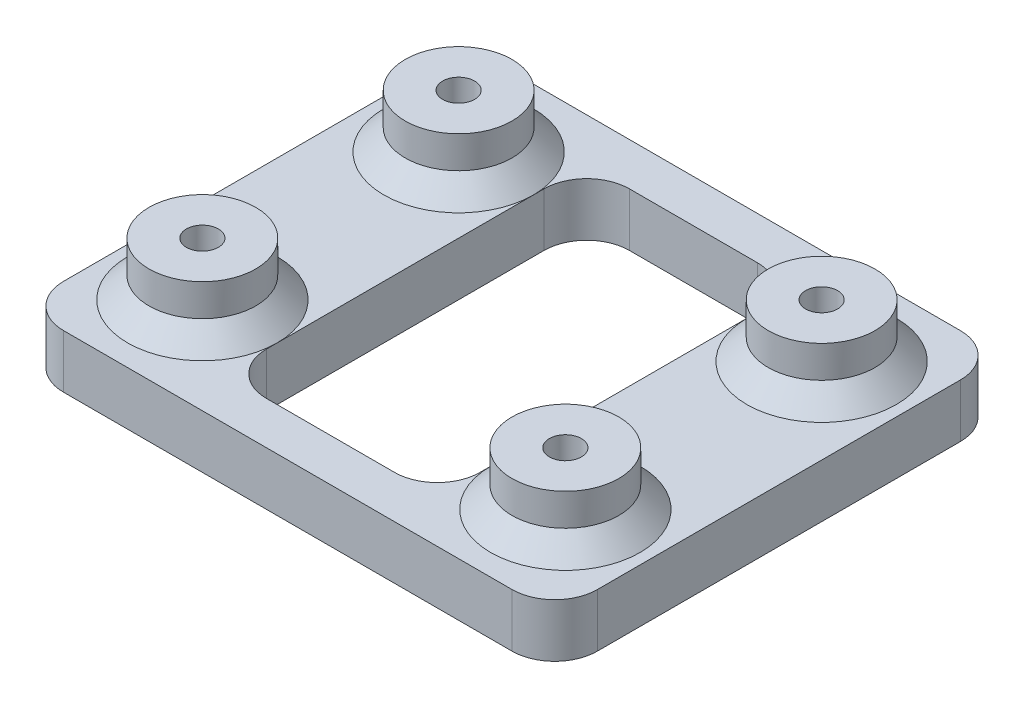
ISO-10303-21;
HEADER;
FILE_DESCRIPTION(('STEP AP214'),'2;1');
FILE_NAME('part.step','',(''),(''),'','','');
FILE_SCHEMA(('AUTOMOTIVE_DESIGN { 1 0 10303 214 1 1 1 1 }'));
ENDSEC;
DATA;
#1=APPLICATION_CONTEXT('core data for automotive mechanical design processes');
#2=APPLICATION_PROTOCOL_DEFINITION('international standard','automotive_design',2000,#1);
#3=PRODUCT_CONTEXT('',#1,'mechanical');
#4=PRODUCT('Part','Part','',(#3));
#5=PRODUCT_RELATED_PRODUCT_CATEGORY('part','',(#4));
#6=PRODUCT_DEFINITION_FORMATION('','',#4);
#7=PRODUCT_DEFINITION_CONTEXT('part definition',#1,'design');
#8=PRODUCT_DEFINITION('design','',#6,#7);
#9=PRODUCT_DEFINITION_SHAPE('','',#8);
#10=(LENGTH_UNIT() NAMED_UNIT(*) SI_UNIT(.MILLI.,.METRE.));
#11=(NAMED_UNIT(*) PLANE_ANGLE_UNIT() SI_UNIT($,.RADIAN.));
#12=(NAMED_UNIT(*) SI_UNIT($,.STERADIAN.) SOLID_ANGLE_UNIT());
#13=UNCERTAINTY_MEASURE_WITH_UNIT(LENGTH_MEASURE(1.E-05),#10,'distance_accuracy_value','');
#14=(GEOMETRIC_REPRESENTATION_CONTEXT(3) GLOBAL_UNCERTAINTY_ASSIGNED_CONTEXT((#13)) GLOBAL_UNIT_ASSIGNED_CONTEXT((#10,
#11,#12)) REPRESENTATION_CONTEXT('',''));
#15=CARTESIAN_POINT('',(0.,0.,0.));
#16=DIRECTION('',(0.,0.,1.));
#17=DIRECTION('',(1.,0.,0.));
#18=AXIS2_PLACEMENT_3D('',#15,#16,#17);
#19=CARTESIAN_POINT('',(0.,3.175,0.));
#20=DIRECTION('',(0.,-1.,0.));
#21=DIRECTION('',(0.,0.,-1.));
#22=AXIS2_PLACEMENT_3D('',#19,#20,#21);
#23=PLANE('',#22);
#24=DIRECTION('',(0.,0.,1.));
#25=VECTOR('',#24,1.);
#26=CARTESIAN_POINT('',(-6.35,3.175,10.795));
#27=LINE('',#26,#25);
#28=CARTESIAN_POINT('',(-6.35,3.175,-7.62));
#29=VERTEX_POINT('',#28);
#30=CARTESIAN_POINT('',(-6.35,3.175,7.62));
#31=VERTEX_POINT('',#30);
#32=EDGE_CURVE('E584',#29,#31,#27,.T.);
#33=ORIENTED_EDGE('',*,*,#32,.F.);
#34=CARTESIAN_POINT('',(-10.795,3.175,-7.62));
#35=DIRECTION('',(0.,-1.,0.));
#36=DIRECTION('',(0.,0.,-1.));
#37=AXIS2_PLACEMENT_3D('',#34,#35,#36);
#38=CIRCLE('',#37,4.44499999999999);
#39=EDGE_CURVE('E58',#29,#29,#38,.T.);
#40=ORIENTED_EDGE('',*,*,#39,.T.);
#41=CARTESIAN_POINT('',(-6.35,3.175,-8.255));
#42=VERTEX_POINT('',#41);
#43=EDGE_CURVE('E576',#42,#29,#27,.T.);
#44=ORIENTED_EDGE('',*,*,#43,.F.);
#45=CARTESIAN_POINT('',(-3.81,3.175,-8.255));
#46=DIRECTION('',(0.,-1.,0.));
#47=DIRECTION('',(0.,0.,-1.));
#48=AXIS2_PLACEMENT_3D('',#45,#46,#47);
#49=CIRCLE('',#48,2.54);
#50=CARTESIAN_POINT('',(-3.81,3.175,-10.795));
#51=VERTEX_POINT('',#50);
#52=EDGE_CURVE('E297',#42,#51,#49,.T.);
#53=ORIENTED_EDGE('',*,*,#52,.T.);
#54=DIRECTION('',(-1.,0.,0.));
#55=VECTOR('',#54,1.);
#56=CARTESIAN_POINT('',(-6.35,3.175,-10.795));
#57=LINE('',#56,#55);
#58=CARTESIAN_POINT('',(3.81,3.175,-10.795));
#59=VERTEX_POINT('',#58);
#60=EDGE_CURVE('E604',#59,#51,#57,.T.);
#61=ORIENTED_EDGE('',*,*,#60,.F.);
#62=CARTESIAN_POINT('',(3.81,3.175,-8.255));
#63=DIRECTION('',(0.,-1.,0.));
#64=DIRECTION('',(0.,0.,-1.));
#65=AXIS2_PLACEMENT_3D('',#62,#63,#64);
#66=CIRCLE('',#65,2.54);
#67=CARTESIAN_POINT('',(6.35,3.175,-8.255));
#68=VERTEX_POINT('',#67);
#69=EDGE_CURVE('E290',#59,#68,#66,.T.);
#70=ORIENTED_EDGE('',*,*,#69,.T.);
#71=DIRECTION('',(0.,0.,-1.));
#72=VECTOR('',#71,1.);
#73=CARTESIAN_POINT('',(6.35,3.175,10.795));
#74=LINE('',#73,#72);
#75=CARTESIAN_POINT('',(6.35,3.175,-7.62));
#76=VERTEX_POINT('',#75);
#77=EDGE_CURVE('E606',#76,#68,#74,.T.);
#78=ORIENTED_EDGE('',*,*,#77,.F.);
#79=CARTESIAN_POINT('',(10.795,3.175,-7.62));
#80=DIRECTION('',(0.,-1.,0.));
#81=DIRECTION('',(0.,0.,-1.));
#82=AXIS2_PLACEMENT_3D('',#79,#80,#81);
#83=CIRCLE('',#82,4.44499999999999);
#84=EDGE_CURVE('E313',#76,#76,#83,.T.);
#85=ORIENTED_EDGE('',*,*,#84,.T.);
#86=CARTESIAN_POINT('',(6.35,3.175,7.62));
#87=VERTEX_POINT('',#86);
#88=EDGE_CURVE('E605',#87,#76,#74,.T.);
#89=ORIENTED_EDGE('',*,*,#88,.F.);
#90=CARTESIAN_POINT('',(10.795,3.175,7.62));
#91=DIRECTION('',(0.,-1.,0.));
#92=DIRECTION('',(0.,0.,-1.));
#93=AXIS2_PLACEMENT_3D('',#90,#91,#92);
#94=CIRCLE('',#93,4.44499999999999);
#95=EDGE_CURVE('E309',#87,#87,#94,.T.);
#96=ORIENTED_EDGE('',*,*,#95,.T.);
#97=CARTESIAN_POINT('',(6.35,3.175,8.255));
#98=VERTEX_POINT('',#97);
#99=EDGE_CURVE('E601',#98,#87,#74,.T.);
#100=ORIENTED_EDGE('',*,*,#99,.F.);
#101=CARTESIAN_POINT('',(3.81,3.175,8.255));
#102=DIRECTION('',(0.,-1.,0.));
#103=DIRECTION('',(0.,0.,-1.));
#104=AXIS2_PLACEMENT_3D('',#101,#102,#103);
#105=CIRCLE('',#104,2.54);
#106=CARTESIAN_POINT('',(3.81,3.175,10.795));
#107=VERTEX_POINT('',#106);
#108=EDGE_CURVE('E284',#98,#107,#105,.T.);
#109=ORIENTED_EDGE('',*,*,#108,.T.);
#110=DIRECTION('',(1.,0.,0.));
#111=VECTOR('',#110,1.);
#112=CARTESIAN_POINT('',(-6.35,3.175,10.795));
#113=LINE('',#112,#111);
#114=CARTESIAN_POINT('',(-3.81,3.175,10.795));
#115=VERTEX_POINT('',#114);
#116=EDGE_CURVE('E572',#115,#107,#113,.T.);
#117=ORIENTED_EDGE('',*,*,#116,.F.);
#118=CARTESIAN_POINT('',(-3.81,3.175,8.255));
#119=DIRECTION('',(0.,-1.,0.));
#120=DIRECTION('',(0.,0.,-1.));
#121=AXIS2_PLACEMENT_3D('',#118,#119,#120);
#122=CIRCLE('',#121,2.54);
#123=CARTESIAN_POINT('',(-6.35,3.175,8.255));
#124=VERTEX_POINT('',#123);
#125=EDGE_CURVE('E277',#115,#124,#122,.T.);
#126=ORIENTED_EDGE('',*,*,#125,.T.);
#127=EDGE_CURVE('E570',#31,#124,#27,.T.);
#128=ORIENTED_EDGE('',*,*,#127,.F.);
#129=CARTESIAN_POINT('',(-10.795,3.175,7.62));
#130=DIRECTION('',(0.,-1.,0.));
#131=DIRECTION('',(0.,0.,-1.));
#132=AXIS2_PLACEMENT_3D('',#129,#130,#131);
#133=CIRCLE('',#132,4.44499999999999);
#134=EDGE_CURVE('E53',#31,#31,#133,.T.);
#135=ORIENTED_EDGE('',*,*,#134,.T.);
#136=EDGE_LOOP('',(#33,#40,#44,#53,#61,#70,#78,#85,#89,#96,#100,#109,#117,#126,#128,#135));
#137=FACE_BOUND('',#136,.T.);
#138=DIRECTION('',(0.,0.,-1.));
#139=VECTOR('',#138,1.);
#140=CARTESIAN_POINT('',(15.875,3.175,13.335));
#141=LINE('',#140,#139);
#142=CARTESIAN_POINT('',(15.875,3.175,10.795));
#143=VERTEX_POINT('',#142);
#144=CARTESIAN_POINT('',(15.875,3.175,-10.795));
#145=VERTEX_POINT('',#144);
#146=EDGE_CURVE('E207',#143,#145,#141,.T.);
#147=ORIENTED_EDGE('',*,*,#146,.T.);
#148=CARTESIAN_POINT('',(13.335,3.175,-10.795));
#149=DIRECTION('',(0.,-1.,0.));
#150=DIRECTION('',(0.,0.,-1.));
#151=AXIS2_PLACEMENT_3D('',#148,#149,#150);
#152=CIRCLE('',#151,2.54);
#153=CARTESIAN_POINT('',(13.335,3.175,-13.335));
#154=VERTEX_POINT('',#153);
#155=EDGE_CURVE('E232',#145,#154,#152,.F.);
#156=ORIENTED_EDGE('',*,*,#155,.T.);
#157=DIRECTION('',(-1.,0.,0.));
#158=VECTOR('',#157,1.);
#159=CARTESIAN_POINT('',(-15.875,3.175,-13.335));
#160=LINE('',#159,#158);
#161=CARTESIAN_POINT('',(-13.335,3.175,-13.335));
#162=VERTEX_POINT('',#161);
#163=EDGE_CURVE('E184',#154,#162,#160,.T.);
#164=ORIENTED_EDGE('',*,*,#163,.T.);
#165=CARTESIAN_POINT('',(-13.335,3.175,-10.795));
#166=DIRECTION('',(0.,-1.,0.));
#167=DIRECTION('',(0.,0.,-1.));
#168=AXIS2_PLACEMENT_3D('',#165,#166,#167);
#169=CIRCLE('',#168,2.54);
#170=CARTESIAN_POINT('',(-15.875,3.175,-10.795));
#171=VERTEX_POINT('',#170);
#172=EDGE_CURVE('E223',#162,#171,#169,.F.);
#173=ORIENTED_EDGE('',*,*,#172,.T.);
#174=DIRECTION('',(0.,0.,1.));
#175=VECTOR('',#174,1.);
#176=CARTESIAN_POINT('',(-15.875,3.175,13.335));
#177=LINE('',#176,#175);
#178=CARTESIAN_POINT('',(-15.875,3.175,10.795));
#179=VERTEX_POINT('',#178);
#180=EDGE_CURVE('E444',#171,#179,#177,.T.);
#181=ORIENTED_EDGE('',*,*,#180,.T.);
#182=CARTESIAN_POINT('',(-13.335,3.175,10.795));
#183=DIRECTION('',(0.,-1.,0.));
#184=DIRECTION('',(0.,0.,-1.));
#185=AXIS2_PLACEMENT_3D('',#182,#183,#184);
#186=CIRCLE('',#185,2.54);
#187=CARTESIAN_POINT('',(-13.335,3.175,13.335));
#188=VERTEX_POINT('',#187);
#189=EDGE_CURVE('E226',#179,#188,#186,.F.);
#190=ORIENTED_EDGE('',*,*,#189,.T.);
#191=DIRECTION('',(1.,0.,0.));
#192=VECTOR('',#191,1.);
#193=CARTESIAN_POINT('',(-15.875,3.175,13.335));
#194=LINE('',#193,#192);
#195=CARTESIAN_POINT('',(13.335,3.175,13.335));
#196=VERTEX_POINT('',#195);
#197=EDGE_CURVE('E209',#188,#196,#194,.T.);
#198=ORIENTED_EDGE('',*,*,#197,.T.);
#199=CARTESIAN_POINT('',(13.335,3.175,10.795));
#200=DIRECTION('',(0.,-1.,0.));
#201=DIRECTION('',(0.,0.,-1.));
#202=AXIS2_PLACEMENT_3D('',#199,#200,#201);
#203=CIRCLE('',#202,2.54);
#204=EDGE_CURVE('E229',#196,#143,#203,.F.);
#205=ORIENTED_EDGE('',*,*,#204,.T.);
#206=EDGE_LOOP('',(#147,#156,#164,#173,#181,#190,#198,#205));
#207=FACE_BOUND('',#206,.T.);
#208=ADVANCED_FACE('F39',(#137,#207),#23,.F.);
#209=CARTESIAN_POINT('',(15.875,3.175,13.335));
#210=DIRECTION('',(-1.,0.,0.));
#211=DIRECTION('',(0.,0.,1.));
#212=AXIS2_PLACEMENT_3D('',#209,#210,#211);
#213=PLANE('',#212);
#214=DIRECTION('',(0.,0.,-1.));
#215=VECTOR('',#214,1.);
#216=CARTESIAN_POINT('',(15.875,0.,13.335));
#217=LINE('',#216,#215);
#218=CARTESIAN_POINT('',(15.875,0.,10.795));
#219=VERTEX_POINT('',#218);
#220=CARTESIAN_POINT('',(15.875,0.,-10.795));
#221=VERTEX_POINT('',#220);
#222=EDGE_CURVE('E193',#219,#221,#217,.T.);
#223=ORIENTED_EDGE('',*,*,#222,.T.);
#224=DIRECTION('',(0.,-1.,0.));
#225=VECTOR('',#224,1.);
#226=CARTESIAN_POINT('',(15.875,3.175,-10.795));
#227=LINE('',#226,#225);
#228=EDGE_CURVE('E168',#221,#145,#227,.F.);
#229=ORIENTED_EDGE('',*,*,#228,.T.);
#230=ORIENTED_EDGE('',*,*,#146,.F.);
#231=DIRECTION('',(0.,-1.,0.));
#232=VECTOR('',#231,1.);
#233=CARTESIAN_POINT('',(15.875,3.175,10.795));
#234=LINE('',#233,#232);
#235=EDGE_CURVE('E174',#143,#219,#234,.T.);
#236=ORIENTED_EDGE('',*,*,#235,.T.);
#237=EDGE_LOOP('',(#223,#229,#230,#236));
#238=FACE_BOUND('',#237,.T.);
#239=ADVANCED_FACE('F341',(#238),#213,.F.);
#240=CARTESIAN_POINT('',(-15.875,3.175,-13.335));
#241=DIRECTION('',(0.,0.,1.));
#242=DIRECTION('',(1.,0.,0.));
#243=AXIS2_PLACEMENT_3D('',#240,#241,#242);
#244=PLANE('',#243);
#245=ORIENTED_EDGE('',*,*,#163,.F.);
#246=DIRECTION('',(0.,-1.,0.));
#247=VECTOR('',#246,1.);
#248=CARTESIAN_POINT('',(13.335,3.175,-13.335));
#249=LINE('',#248,#247);
#250=CARTESIAN_POINT('',(13.335,0.,-13.335));
#251=VERTEX_POINT('',#250);
#252=EDGE_CURVE('E167',#154,#251,#249,.T.);
#253=ORIENTED_EDGE('',*,*,#252,.T.);
#254=DIRECTION('',(-1.,0.,0.));
#255=VECTOR('',#254,1.);
#256=CARTESIAN_POINT('',(-15.875,0.,-13.335));
#257=LINE('',#256,#255);
#258=CARTESIAN_POINT('',(-13.335,0.,-13.335));
#259=VERTEX_POINT('',#258);
#260=EDGE_CURVE('E181',#251,#259,#257,.T.);
#261=ORIENTED_EDGE('',*,*,#260,.T.);
#262=DIRECTION('',(0.,-1.,0.));
#263=VECTOR('',#262,1.);
#264=CARTESIAN_POINT('',(-13.335,3.175,-13.335));
#265=LINE('',#264,#263);
#266=EDGE_CURVE('E187',#259,#162,#265,.F.);
#267=ORIENTED_EDGE('',*,*,#266,.T.);
#268=EDGE_LOOP('',(#245,#253,#261,#267));
#269=FACE_BOUND('',#268,.T.);
#270=ADVANCED_FACE('F180',(#269),#244,.F.);
#271=CARTESIAN_POINT('',(-15.875,3.175,13.335));
#272=DIRECTION('',(1.,0.,0.));
#273=DIRECTION('',(0.,0.,-1.));
#274=AXIS2_PLACEMENT_3D('',#271,#272,#273);
#275=PLANE('',#274);
#276=DIRECTION('',(0.,0.,1.));
#277=VECTOR('',#276,1.);
#278=CARTESIAN_POINT('',(-15.875,0.,13.335));
#279=LINE('',#278,#277);
#280=CARTESIAN_POINT('',(-15.875,0.,-10.795));
#281=VERTEX_POINT('',#280);
#282=CARTESIAN_POINT('',(-15.875,0.,10.795));
#283=VERTEX_POINT('',#282);
#284=EDGE_CURVE('E192',#281,#283,#279,.T.);
#285=ORIENTED_EDGE('',*,*,#284,.T.);
#286=DIRECTION('',(0.,-1.,0.));
#287=VECTOR('',#286,1.);
#288=CARTESIAN_POINT('',(-15.875,3.175,10.795));
#289=LINE('',#288,#287);
#290=EDGE_CURVE('E246',#283,#179,#289,.F.);
#291=ORIENTED_EDGE('',*,*,#290,.T.);
#292=ORIENTED_EDGE('',*,*,#180,.F.);
#293=DIRECTION('',(0.,-1.,0.));
#294=VECTOR('',#293,1.);
#295=CARTESIAN_POINT('',(-15.875,3.175,-10.795));
#296=LINE('',#295,#294);
#297=EDGE_CURVE('E242',#171,#281,#296,.T.);
#298=ORIENTED_EDGE('',*,*,#297,.T.);
#299=EDGE_LOOP('',(#285,#291,#292,#298));
#300=FACE_BOUND('',#299,.T.);
#301=ADVANCED_FACE('F361',(#300),#275,.F.);
#302=CARTESIAN_POINT('',(-15.875,3.175,13.335));
#303=DIRECTION('',(0.,0.,-1.));
#304=DIRECTION('',(-1.,0.,0.));
#305=AXIS2_PLACEMENT_3D('',#302,#303,#304);
#306=PLANE('',#305);
#307=DIRECTION('',(1.,0.,0.));
#308=VECTOR('',#307,1.);
#309=CARTESIAN_POINT('',(-15.875,0.,13.335));
#310=LINE('',#309,#308);
#311=CARTESIAN_POINT('',(-13.335,0.,13.335));
#312=VERTEX_POINT('',#311);
#313=CARTESIAN_POINT('',(13.335,0.,13.335));
#314=VERTEX_POINT('',#313);
#315=EDGE_CURVE('E198',#312,#314,#310,.T.);
#316=ORIENTED_EDGE('',*,*,#315,.T.);
#317=DIRECTION('',(0.,-1.,0.));
#318=VECTOR('',#317,1.);
#319=CARTESIAN_POINT('',(13.335,3.175,13.335));
#320=LINE('',#319,#318);
#321=EDGE_CURVE('E239',#314,#196,#320,.F.);
#322=ORIENTED_EDGE('',*,*,#321,.T.);
#323=ORIENTED_EDGE('',*,*,#197,.F.);
#324=DIRECTION('',(0.,-1.,0.));
#325=VECTOR('',#324,1.);
#326=CARTESIAN_POINT('',(-13.335,3.175,13.335));
#327=LINE('',#326,#325);
#328=EDGE_CURVE('E235',#188,#312,#327,.T.);
#329=ORIENTED_EDGE('',*,*,#328,.T.);
#330=EDGE_LOOP('',(#316,#322,#323,#329));
#331=FACE_BOUND('',#330,.T.);
#332=ADVANCED_FACE('F357',(#331),#306,.F.);
#333=CARTESIAN_POINT('',(0.,0.,0.));
#334=DIRECTION('',(0.,-1.,0.));
#335=DIRECTION('',(0.,0.,-1.));
#336=AXIS2_PLACEMENT_3D('',#333,#334,#335);
#337=PLANE('',#336);
#338=DIRECTION('',(1.,0.,0.));
#339=VECTOR('',#338,1.);
#340=CARTESIAN_POINT('',(-6.35,0.,10.795));
#341=LINE('',#340,#339);
#342=CARTESIAN_POINT('',(-3.81,0.,10.795));
#343=VERTEX_POINT('',#342);
#344=CARTESIAN_POINT('',(3.81,0.,10.795));
#345=VERTEX_POINT('',#344);
#346=EDGE_CURVE('E558',#343,#345,#341,.T.);
#347=ORIENTED_EDGE('',*,*,#346,.T.);
#348=CARTESIAN_POINT('',(3.81,0.,8.255));
#349=DIRECTION('',(0.,-1.,0.));
#350=DIRECTION('',(0.,0.,-1.));
#351=AXIS2_PLACEMENT_3D('',#348,#349,#350);
#352=CIRCLE('',#351,2.54);
#353=CARTESIAN_POINT('',(6.35,0.,8.255));
#354=VERTEX_POINT('',#353);
#355=EDGE_CURVE('E287',#345,#354,#352,.F.);
#356=ORIENTED_EDGE('',*,*,#355,.T.);
#357=DIRECTION('',(0.,0.,-1.));
#358=VECTOR('',#357,1.);
#359=CARTESIAN_POINT('',(6.35,0.,10.795));
#360=LINE('',#359,#358);
#361=CARTESIAN_POINT('',(6.35,0.,-8.255));
#362=VERTEX_POINT('',#361);
#363=EDGE_CURVE('E575',#354,#362,#360,.T.);
#364=ORIENTED_EDGE('',*,*,#363,.T.);
#365=CARTESIAN_POINT('',(3.81,0.,-8.255));
#366=DIRECTION('',(0.,-1.,0.));
#367=DIRECTION('',(0.,0.,-1.));
#368=AXIS2_PLACEMENT_3D('',#365,#366,#367);
#369=CIRCLE('',#368,2.54);
#370=CARTESIAN_POINT('',(3.81,0.,-10.795));
#371=VERTEX_POINT('',#370);
#372=EDGE_CURVE('E294',#362,#371,#369,.F.);
#373=ORIENTED_EDGE('',*,*,#372,.T.);
#374=DIRECTION('',(-1.,0.,0.));
#375=VECTOR('',#374,1.);
#376=CARTESIAN_POINT('',(-6.35,0.,-10.795));
#377=LINE('',#376,#375);
#378=CARTESIAN_POINT('',(-3.81,0.,-10.795));
#379=VERTEX_POINT('',#378);
#380=EDGE_CURVE('E581',#371,#379,#377,.T.);
#381=ORIENTED_EDGE('',*,*,#380,.T.);
#382=CARTESIAN_POINT('',(-3.81,0.,-8.255));
#383=DIRECTION('',(0.,-1.,0.));
#384=DIRECTION('',(0.,0.,-1.));
#385=AXIS2_PLACEMENT_3D('',#382,#383,#384);
#386=CIRCLE('',#385,2.54);
#387=CARTESIAN_POINT('',(-6.35,0.,-8.255));
#388=VERTEX_POINT('',#387);
#389=EDGE_CURVE('E300',#379,#388,#386,.F.);
#390=ORIENTED_EDGE('',*,*,#389,.T.);
#391=DIRECTION('',(0.,0.,1.));
#392=VECTOR('',#391,1.);
#393=CARTESIAN_POINT('',(-6.35,0.,10.795));
#394=LINE('',#393,#392);
#395=CARTESIAN_POINT('',(-6.35,0.,8.255));
#396=VERTEX_POINT('',#395);
#397=EDGE_CURVE('E565',#388,#396,#394,.T.);
#398=ORIENTED_EDGE('',*,*,#397,.T.);
#399=CARTESIAN_POINT('',(-3.81,0.,8.255));
#400=DIRECTION('',(0.,-1.,0.));
#401=DIRECTION('',(0.,0.,-1.));
#402=AXIS2_PLACEMENT_3D('',#399,#400,#401);
#403=CIRCLE('',#402,2.54);
#404=EDGE_CURVE('E281',#396,#343,#403,.F.);
#405=ORIENTED_EDGE('',*,*,#404,.T.);
#406=EDGE_LOOP('',(#347,#356,#364,#373,#381,#390,#398,#405));
#407=FACE_BOUND('',#406,.T.);
#408=CARTESIAN_POINT('',(-10.795,0.,7.62));
#409=DIRECTION('',(0.,1.,0.));
#410=DIRECTION('',(0.,0.,1.));
#411=AXIS2_PLACEMENT_3D('',#408,#409,#410);
#412=CIRCLE('',#411,0.949999999999999);
#413=CARTESIAN_POINT('',(-10.795,0.,8.57));
#414=VERTEX_POINT('',#413);
#415=EDGE_CURVE('E416',#414,#414,#412,.T.);
#416=ORIENTED_EDGE('',*,*,#415,.T.);
#417=EDGE_LOOP('',(#416));
#418=FACE_BOUND('',#417,.T.);
#419=CARTESIAN_POINT('',(10.795,0.,7.62));
#420=DIRECTION('',(0.,1.,0.));
#421=DIRECTION('',(0.,0.,1.));
#422=AXIS2_PLACEMENT_3D('',#419,#420,#421);
#423=CIRCLE('',#422,0.949999999999999);
#424=CARTESIAN_POINT('',(10.795,0.,8.57));
#425=VERTEX_POINT('',#424);
#426=EDGE_CURVE('E422',#425,#425,#423,.T.);
#427=ORIENTED_EDGE('',*,*,#426,.T.);
#428=EDGE_LOOP('',(#427));
#429=FACE_BOUND('',#428,.T.);
#430=CARTESIAN_POINT('',(10.795,0.,-7.62));
#431=DIRECTION('',(0.,1.,0.));
#432=DIRECTION('',(0.,0.,1.));
#433=AXIS2_PLACEMENT_3D('',#430,#431,#432);
#434=CIRCLE('',#433,0.949999999999999);
#435=CARTESIAN_POINT('',(10.795,0.,-6.67));
#436=VERTEX_POINT('',#435);
#437=EDGE_CURVE('E429',#436,#436,#434,.T.);
#438=ORIENTED_EDGE('',*,*,#437,.T.);
#439=EDGE_LOOP('',(#438));
#440=FACE_BOUND('',#439,.T.);
#441=CARTESIAN_POINT('',(-10.795,0.,-7.62));
#442=DIRECTION('',(0.,1.,0.));
#443=DIRECTION('',(0.,0.,1.));
#444=AXIS2_PLACEMENT_3D('',#441,#442,#443);
#445=CIRCLE('',#444,0.949999999999999);
#446=CARTESIAN_POINT('',(-10.795,0.,-6.67));
#447=VERTEX_POINT('',#446);
#448=EDGE_CURVE('E200',#447,#447,#445,.T.);
#449=ORIENTED_EDGE('',*,*,#448,.T.);
#450=EDGE_LOOP('',(#449));
#451=FACE_BOUND('',#450,.T.);
#452=ORIENTED_EDGE('',*,*,#260,.F.);
#453=CARTESIAN_POINT('',(13.335,0.,-10.795));
#454=DIRECTION('',(0.,-1.,0.));
#455=DIRECTION('',(0.,0.,-1.));
#456=AXIS2_PLACEMENT_3D('',#453,#454,#455);
#457=CIRCLE('',#456,2.54);
#458=EDGE_CURVE('E163',#251,#221,#457,.T.);
#459=ORIENTED_EDGE('',*,*,#458,.T.);
#460=ORIENTED_EDGE('',*,*,#222,.F.);
#461=CARTESIAN_POINT('',(13.335,0.,10.795));
#462=DIRECTION('',(0.,-1.,0.));
#463=DIRECTION('',(0.,0.,-1.));
#464=AXIS2_PLACEMENT_3D('',#461,#462,#463);
#465=CIRCLE('',#464,2.54);
#466=EDGE_CURVE('E175',#219,#314,#465,.T.);
#467=ORIENTED_EDGE('',*,*,#466,.T.);
#468=ORIENTED_EDGE('',*,*,#315,.F.);
#469=CARTESIAN_POINT('',(-13.335,0.,10.795));
#470=DIRECTION('',(0.,-1.,0.));
#471=DIRECTION('',(0.,0.,-1.));
#472=AXIS2_PLACEMENT_3D('',#469,#470,#471);
#473=CIRCLE('',#472,2.54);
#474=EDGE_CURVE('E213',#312,#283,#473,.T.);
#475=ORIENTED_EDGE('',*,*,#474,.T.);
#476=ORIENTED_EDGE('',*,*,#284,.F.);
#477=CARTESIAN_POINT('',(-13.335,0.,-10.795));
#478=DIRECTION('',(0.,-1.,0.));
#479=DIRECTION('',(0.,0.,-1.));
#480=AXIS2_PLACEMENT_3D('',#477,#478,#479);
#481=CIRCLE('',#480,2.54);
#482=EDGE_CURVE('E186',#281,#259,#481,.T.);
#483=ORIENTED_EDGE('',*,*,#482,.T.);
#484=EDGE_LOOP('',(#452,#459,#460,#467,#468,#475,#476,#483));
#485=FACE_BOUND('',#484,.T.);
#486=ADVANCED_FACE('F189',(#407,#418,#429,#440,#451,#485),#337,.T.);
#487=CARTESIAN_POINT('',(-10.795,0.,-7.62));
#488=DIRECTION('',(0.,1.,0.));
#489=DIRECTION('',(0.,0.,1.));
#490=AXIS2_PLACEMENT_3D('',#487,#488,#489);
#491=CYLINDRICAL_SURFACE('',#490,0.949999999999999);
#492=ORIENTED_EDGE('',*,*,#448,.F.);
#493=EDGE_LOOP('',(#492));
#494=FACE_BOUND('',#493,.T.);
#495=CARTESIAN_POINT('',(-10.795,6.35,-7.62));
#496=DIRECTION('',(0.,1.,0.));
#497=DIRECTION('',(0.,0.,1.));
#498=AXIS2_PLACEMENT_3D('',#495,#496,#497);
#499=CIRCLE('',#498,0.949999999999999);
#500=CARTESIAN_POINT('',(-10.795,6.35,-6.67));
#501=VERTEX_POINT('',#500);
#502=EDGE_CURVE('E417',#501,#501,#499,.T.);
#503=ORIENTED_EDGE('',*,*,#502,.T.);
#504=EDGE_LOOP('',(#503));
#505=FACE_BOUND('',#504,.T.);
#506=ADVANCED_FACE('F353',(#494,#505),#491,.F.);
#507=CARTESIAN_POINT('',(10.795,0.,-7.62));
#508=DIRECTION('',(0.,1.,0.));
#509=DIRECTION('',(0.,0.,1.));
#510=AXIS2_PLACEMENT_3D('',#507,#508,#509);
#511=CYLINDRICAL_SURFACE('',#510,0.949999999999999);
#512=ORIENTED_EDGE('',*,*,#437,.F.);
#513=EDGE_LOOP('',(#512));
#514=FACE_BOUND('',#513,.T.);
#515=CARTESIAN_POINT('',(10.795,6.35,-7.62));
#516=DIRECTION('',(0.,1.,0.));
#517=DIRECTION('',(0.,0.,1.));
#518=AXIS2_PLACEMENT_3D('',#515,#516,#517);
#519=CIRCLE('',#518,0.949999999999999);
#520=CARTESIAN_POINT('',(10.795,6.35,-6.67));
#521=VERTEX_POINT('',#520);
#522=EDGE_CURVE('E501',#521,#521,#519,.T.);
#523=ORIENTED_EDGE('',*,*,#522,.T.);
#524=EDGE_LOOP('',(#523));
#525=FACE_BOUND('',#524,.T.);
#526=ADVANCED_FACE('F466',(#514,#525),#511,.F.);
#527=CARTESIAN_POINT('',(10.795,0.,7.62));
#528=DIRECTION('',(0.,1.,0.));
#529=DIRECTION('',(0.,0.,1.));
#530=AXIS2_PLACEMENT_3D('',#527,#528,#529);
#531=CYLINDRICAL_SURFACE('',#530,0.949999999999999);
#532=ORIENTED_EDGE('',*,*,#426,.F.);
#533=EDGE_LOOP('',(#532));
#534=FACE_BOUND('',#533,.T.);
#535=CARTESIAN_POINT('',(10.795,6.35,7.62));
#536=DIRECTION('',(0.,1.,0.));
#537=DIRECTION('',(0.,0.,1.));
#538=AXIS2_PLACEMENT_3D('',#535,#536,#537);
#539=CIRCLE('',#538,0.949999999999999);
#540=CARTESIAN_POINT('',(10.795,6.35,8.57));
#541=VERTEX_POINT('',#540);
#542=EDGE_CURVE('E492',#541,#541,#539,.T.);
#543=ORIENTED_EDGE('',*,*,#542,.T.);
#544=EDGE_LOOP('',(#543));
#545=FACE_BOUND('',#544,.T.);
#546=ADVANCED_FACE('F475',(#534,#545),#531,.F.);
#547=CARTESIAN_POINT('',(-10.795,0.,7.62));
#548=DIRECTION('',(0.,1.,0.));
#549=DIRECTION('',(0.,0.,1.));
#550=AXIS2_PLACEMENT_3D('',#547,#548,#549);
#551=CYLINDRICAL_SURFACE('',#550,0.949999999999999);
#552=ORIENTED_EDGE('',*,*,#415,.F.);
#553=EDGE_LOOP('',(#552));
#554=FACE_BOUND('',#553,.T.);
#555=CARTESIAN_POINT('',(-10.795,6.35,7.62));
#556=DIRECTION('',(0.,1.,0.));
#557=DIRECTION('',(0.,0.,1.));
#558=AXIS2_PLACEMENT_3D('',#555,#556,#557);
#559=CIRCLE('',#558,0.949999999999999);
#560=CARTESIAN_POINT('',(-10.795,6.35,8.57));
#561=VERTEX_POINT('',#560);
#562=EDGE_CURVE('E504',#561,#561,#559,.T.);
#563=ORIENTED_EDGE('',*,*,#562,.T.);
#564=EDGE_LOOP('',(#563));
#565=FACE_BOUND('',#564,.T.);
#566=ADVANCED_FACE('F470',(#554,#565),#551,.F.);
#567=CARTESIAN_POINT('',(-10.795,6.35,-7.62));
#568=DIRECTION('',(0.,1.,0.));
#569=DIRECTION('',(0.,0.,1.));
#570=AXIS2_PLACEMENT_3D('',#567,#568,#569);
#571=PLANE('',#570);
#572=CARTESIAN_POINT('',(-10.795,6.35,-7.62));
#573=DIRECTION('',(0.,1.,0.));
#574=DIRECTION('',(0.,0.,1.));
#575=AXIS2_PLACEMENT_3D('',#572,#573,#574);
#576=CIRCLE('',#575,3.175);
#577=CARTESIAN_POINT('',(-10.795,6.35,-4.445));
#578=VERTEX_POINT('',#577);
#579=EDGE_CURVE('E413',#578,#578,#576,.T.);
#580=ORIENTED_EDGE('',*,*,#579,.T.);
#581=EDGE_LOOP('',(#580));
#582=FACE_BOUND('',#581,.T.);
#583=ORIENTED_EDGE('',*,*,#502,.F.);
#584=EDGE_LOOP('',(#583));
#585=FACE_BOUND('',#584,.T.);
#586=ADVANCED_FACE('F409',(#582,#585),#571,.T.);
#587=CARTESIAN_POINT('',(-10.795,6.35,-7.62));
#588=DIRECTION('',(0.,-1.,0.));
#589=DIRECTION('',(0.,0.,-1.));
#590=AXIS2_PLACEMENT_3D('',#587,#588,#589);
#591=CYLINDRICAL_SURFACE('',#590,3.175);
#592=CARTESIAN_POINT('',(-10.795,4.44500000000001,-7.62));
#593=DIRECTION('',(0.,-1.,0.));
#594=DIRECTION('',(0.,0.,-1.));
#595=AXIS2_PLACEMENT_3D('',#592,#593,#594);
#596=CIRCLE('',#595,3.175);
#597=CARTESIAN_POINT('',(-10.795,4.44500000000001,-10.795));
#598=VERTEX_POINT('',#597);
#599=EDGE_CURVE('E303',#598,#598,#596,.F.);
#600=ORIENTED_EDGE('',*,*,#599,.T.);
#601=EDGE_LOOP('',(#600));
#602=FACE_BOUND('',#601,.T.);
#603=ORIENTED_EDGE('',*,*,#579,.F.);
#604=EDGE_LOOP('',(#603));
#605=FACE_BOUND('',#604,.T.);
#606=ADVANCED_FACE('F405',(#602,#605),#591,.T.);
#607=CARTESIAN_POINT('',(10.795,6.35,-7.62));
#608=DIRECTION('',(0.,1.,0.));
#609=DIRECTION('',(0.,0.,1.));
#610=AXIS2_PLACEMENT_3D('',#607,#608,#609);
#611=PLANE('',#610);
#612=CARTESIAN_POINT('',(10.795,6.35,-7.62));
#613=DIRECTION('',(0.,1.,0.));
#614=DIRECTION('',(0.,0.,1.));
#615=AXIS2_PLACEMENT_3D('',#612,#613,#614);
#616=CIRCLE('',#615,3.175);
#617=CARTESIAN_POINT('',(10.795,6.35,-4.445));
#618=VERTEX_POINT('',#617);
#619=EDGE_CURVE('E425',#618,#618,#616,.T.);
#620=ORIENTED_EDGE('',*,*,#619,.T.);
#621=EDGE_LOOP('',(#620));
#622=FACE_BOUND('',#621,.T.);
#623=ORIENTED_EDGE('',*,*,#522,.F.);
#624=EDGE_LOOP('',(#623));
#625=FACE_BOUND('',#624,.T.);
#626=ADVANCED_FACE('F408',(#622,#625),#611,.T.);
#627=CARTESIAN_POINT('',(10.795,6.35,-7.62));
#628=DIRECTION('',(0.,-1.,0.));
#629=DIRECTION('',(0.,0.,-1.));
#630=AXIS2_PLACEMENT_3D('',#627,#628,#629);
#631=CYLINDRICAL_SURFACE('',#630,3.175);
#632=CARTESIAN_POINT('',(10.795,4.44500000000001,-7.62));
#633=DIRECTION('',(0.,-1.,0.));
#634=DIRECTION('',(0.,0.,-1.));
#635=AXIS2_PLACEMENT_3D('',#632,#633,#634);
#636=CIRCLE('',#635,3.175);
#637=CARTESIAN_POINT('',(10.795,4.44500000000001,-10.795));
#638=VERTEX_POINT('',#637);
#639=EDGE_CURVE('E319',#638,#638,#636,.F.);
#640=ORIENTED_EDGE('',*,*,#639,.T.);
#641=EDGE_LOOP('',(#640));
#642=FACE_BOUND('',#641,.T.);
#643=ORIENTED_EDGE('',*,*,#619,.F.);
#644=EDGE_LOOP('',(#643));
#645=FACE_BOUND('',#644,.T.);
#646=ADVANCED_FACE('F478',(#642,#645),#631,.T.);
#647=CARTESIAN_POINT('',(10.795,6.35,7.62));
#648=DIRECTION('',(0.,1.,0.));
#649=DIRECTION('',(0.,0.,1.));
#650=AXIS2_PLACEMENT_3D('',#647,#648,#649);
#651=PLANE('',#650);
#652=CARTESIAN_POINT('',(10.795,6.35,7.62));
#653=DIRECTION('',(0.,1.,0.));
#654=DIRECTION('',(0.,0.,1.));
#655=AXIS2_PLACEMENT_3D('',#652,#653,#654);
#656=CIRCLE('',#655,3.175);
#657=CARTESIAN_POINT('',(10.795,6.35,10.795));
#658=VERTEX_POINT('',#657);
#659=EDGE_CURVE('E495',#658,#658,#656,.T.);
#660=ORIENTED_EDGE('',*,*,#659,.T.);
#661=EDGE_LOOP('',(#660));
#662=FACE_BOUND('',#661,.T.);
#663=ORIENTED_EDGE('',*,*,#542,.F.);
#664=EDGE_LOOP('',(#663));
#665=FACE_BOUND('',#664,.T.);
#666=ADVANCED_FACE('F517',(#662,#665),#651,.T.);
#667=CARTESIAN_POINT('',(10.795,6.35,7.62));
#668=DIRECTION('',(0.,-1.,0.));
#669=DIRECTION('',(0.,0.,-1.));
#670=AXIS2_PLACEMENT_3D('',#667,#668,#669);
#671=CYLINDRICAL_SURFACE('',#670,3.175);
#672=CARTESIAN_POINT('',(10.795,4.44500000000001,7.62));
#673=DIRECTION('',(0.,-1.,0.));
#674=DIRECTION('',(0.,0.,-1.));
#675=AXIS2_PLACEMENT_3D('',#672,#673,#674);
#676=CIRCLE('',#675,3.175);
#677=CARTESIAN_POINT('',(10.795,4.44500000000001,4.445));
#678=VERTEX_POINT('',#677);
#679=EDGE_CURVE('E48',#678,#678,#676,.F.);
#680=ORIENTED_EDGE('',*,*,#679,.T.);
#681=EDGE_LOOP('',(#680));
#682=FACE_BOUND('',#681,.T.);
#683=ORIENTED_EDGE('',*,*,#659,.F.);
#684=EDGE_LOOP('',(#683));
#685=FACE_BOUND('',#684,.T.);
#686=ADVANCED_FACE('F326',(#682,#685),#671,.T.);
#687=CARTESIAN_POINT('',(-10.795,6.35,7.62));
#688=DIRECTION('',(0.,1.,0.));
#689=DIRECTION('',(0.,0.,1.));
#690=AXIS2_PLACEMENT_3D('',#687,#688,#689);
#691=PLANE('',#690);
#692=CARTESIAN_POINT('',(-10.795,6.35,7.62));
#693=DIRECTION('',(0.,1.,0.));
#694=DIRECTION('',(0.,0.,1.));
#695=AXIS2_PLACEMENT_3D('',#692,#693,#694);
#696=CIRCLE('',#695,3.175);
#697=CARTESIAN_POINT('',(-10.795,6.35,10.795));
#698=VERTEX_POINT('',#697);
#699=EDGE_CURVE('E496',#698,#698,#696,.T.);
#700=ORIENTED_EDGE('',*,*,#699,.T.);
#701=EDGE_LOOP('',(#700));
#702=FACE_BOUND('',#701,.T.);
#703=ORIENTED_EDGE('',*,*,#562,.F.);
#704=EDGE_LOOP('',(#703));
#705=FACE_BOUND('',#704,.T.);
#706=ADVANCED_FACE('F531',(#702,#705),#691,.T.);
#707=CARTESIAN_POINT('',(-10.795,6.35,7.62));
#708=DIRECTION('',(0.,-1.,0.));
#709=DIRECTION('',(0.,0.,-1.));
#710=AXIS2_PLACEMENT_3D('',#707,#708,#709);
#711=CYLINDRICAL_SURFACE('',#710,3.175);
#712=CARTESIAN_POINT('',(-10.795,4.44500000000001,7.62));
#713=DIRECTION('',(0.,-1.,0.));
#714=DIRECTION('',(0.,0.,-1.));
#715=AXIS2_PLACEMENT_3D('',#712,#713,#714);
#716=CIRCLE('',#715,3.175);
#717=CARTESIAN_POINT('',(-10.795,4.44500000000001,4.445));
#718=VERTEX_POINT('',#717);
#719=EDGE_CURVE('E11',#718,#718,#716,.F.);
#720=ORIENTED_EDGE('',*,*,#719,.T.);
#721=EDGE_LOOP('',(#720));
#722=FACE_BOUND('',#721,.T.);
#723=ORIENTED_EDGE('',*,*,#699,.F.);
#724=EDGE_LOOP('',(#723));
#725=FACE_BOUND('',#724,.T.);
#726=ADVANCED_FACE('F533',(#722,#725),#711,.T.);
#727=CARTESIAN_POINT('',(6.35,0.,10.795));
#728=DIRECTION('',(1.,0.,0.));
#729=DIRECTION('',(0.,0.,-1.));
#730=AXIS2_PLACEMENT_3D('',#727,#728,#729);
#731=PLANE('',#730);
#732=ORIENTED_EDGE('',*,*,#363,.F.);
#733=DIRECTION('',(0.,1.,0.));
#734=VECTOR('',#733,1.);
#735=CARTESIAN_POINT('',(6.35,3.175,8.255));
#736=LINE('',#735,#734);
#737=EDGE_CURVE('E266',#354,#98,#736,.T.);
#738=ORIENTED_EDGE('',*,*,#737,.T.);
#739=ORIENTED_EDGE('',*,*,#99,.T.);
#740=ORIENTED_EDGE('',*,*,#88,.T.);
#741=ORIENTED_EDGE('',*,*,#77,.T.);
#742=DIRECTION('',(0.,1.,0.));
#743=VECTOR('',#742,1.);
#744=CARTESIAN_POINT('',(6.35,0.,-8.255));
#745=LINE('',#744,#743);
#746=EDGE_CURVE('E263',#68,#362,#745,.F.);
#747=ORIENTED_EDGE('',*,*,#746,.T.);
#748=EDGE_LOOP('',(#732,#738,#739,#740,#741,#747));
#749=FACE_BOUND('',#748,.T.);
#750=ADVANCED_FACE('F536',(#749),#731,.F.);
#751=CARTESIAN_POINT('',(-6.35,0.,10.795));
#752=DIRECTION('',(0.,0.,1.));
#753=DIRECTION('',(1.,0.,0.));
#754=AXIS2_PLACEMENT_3D('',#751,#752,#753);
#755=PLANE('',#754);
#756=ORIENTED_EDGE('',*,*,#346,.F.);
#757=DIRECTION('',(0.,1.,0.));
#758=VECTOR('',#757,1.);
#759=CARTESIAN_POINT('',(-3.81,3.175,10.795));
#760=LINE('',#759,#758);
#761=EDGE_CURVE('E252',#343,#115,#760,.T.);
#762=ORIENTED_EDGE('',*,*,#761,.T.);
#763=ORIENTED_EDGE('',*,*,#116,.T.);
#764=DIRECTION('',(0.,1.,0.));
#765=VECTOR('',#764,1.);
#766=CARTESIAN_POINT('',(3.81,0.,10.795));
#767=LINE('',#766,#765);
#768=EDGE_CURVE('E249',#107,#345,#767,.F.);
#769=ORIENTED_EDGE('',*,*,#768,.T.);
#770=EDGE_LOOP('',(#756,#762,#763,#769));
#771=FACE_BOUND('',#770,.T.);
#772=ADVANCED_FACE('F543',(#771),#755,.F.);
#773=CARTESIAN_POINT('',(-6.35,0.,10.795));
#774=DIRECTION('',(-1.,0.,0.));
#775=DIRECTION('',(0.,0.,1.));
#776=AXIS2_PLACEMENT_3D('',#773,#774,#775);
#777=PLANE('',#776);
#778=ORIENTED_EDGE('',*,*,#43,.T.);
#779=ORIENTED_EDGE('',*,*,#32,.T.);
#780=ORIENTED_EDGE('',*,*,#127,.T.);
#781=DIRECTION('',(0.,1.,0.));
#782=VECTOR('',#781,1.);
#783=CARTESIAN_POINT('',(-6.35,0.,8.255));
#784=LINE('',#783,#782);
#785=EDGE_CURVE('E260',#124,#396,#784,.F.);
#786=ORIENTED_EDGE('',*,*,#785,.T.);
#787=ORIENTED_EDGE('',*,*,#397,.F.);
#788=DIRECTION('',(0.,1.,0.));
#789=VECTOR('',#788,1.);
#790=CARTESIAN_POINT('',(-6.35,3.175,-8.255));
#791=LINE('',#790,#789);
#792=EDGE_CURVE('E256',#388,#42,#791,.T.);
#793=ORIENTED_EDGE('',*,*,#792,.T.);
#794=EDGE_LOOP('',(#778,#779,#780,#786,#787,#793));
#795=FACE_BOUND('',#794,.T.);
#796=ADVANCED_FACE('F547',(#795),#777,.F.);
#797=CARTESIAN_POINT('',(-6.35,0.,-10.795));
#798=DIRECTION('',(0.,0.,-1.));
#799=DIRECTION('',(-1.,0.,0.));
#800=AXIS2_PLACEMENT_3D('',#797,#798,#799);
#801=PLANE('',#800);
#802=ORIENTED_EDGE('',*,*,#380,.F.);
#803=DIRECTION('',(0.,1.,0.));
#804=VECTOR('',#803,1.);
#805=CARTESIAN_POINT('',(3.81,3.175,-10.795));
#806=LINE('',#805,#804);
#807=EDGE_CURVE('E273',#371,#59,#806,.T.);
#808=ORIENTED_EDGE('',*,*,#807,.T.);
#809=ORIENTED_EDGE('',*,*,#60,.T.);
#810=DIRECTION('',(0.,1.,0.));
#811=VECTOR('',#810,1.);
#812=CARTESIAN_POINT('',(-3.81,0.,-10.795));
#813=LINE('',#812,#811);
#814=EDGE_CURVE('E270',#51,#379,#813,.F.);
#815=ORIENTED_EDGE('',*,*,#814,.T.);
#816=EDGE_LOOP('',(#802,#808,#809,#815));
#817=FACE_BOUND('',#816,.T.);
#818=ADVANCED_FACE('F371',(#817),#801,.F.);
#819=CARTESIAN_POINT('',(13.335,3.175,-10.795));
#820=DIRECTION('',(0.,-1.,0.));
#821=DIRECTION('',(0.,0.,-1.));
#822=AXIS2_PLACEMENT_3D('',#819,#820,#821);
#823=CYLINDRICAL_SURFACE('',#822,2.54);
#824=ORIENTED_EDGE('',*,*,#155,.F.);
#825=ORIENTED_EDGE('',*,*,#228,.F.);
#826=ORIENTED_EDGE('',*,*,#458,.F.);
#827=ORIENTED_EDGE('',*,*,#252,.F.);
#828=EDGE_LOOP('',(#824,#825,#826,#827));
#829=FACE_BOUND('',#828,.T.);
#830=ADVANCED_FACE('F166',(#829),#823,.T.);
#831=CARTESIAN_POINT('',(13.335,3.175,10.795));
#832=DIRECTION('',(0.,-1.,0.));
#833=DIRECTION('',(0.,0.,-1.));
#834=AXIS2_PLACEMENT_3D('',#831,#832,#833);
#835=CYLINDRICAL_SURFACE('',#834,2.54);
#836=ORIENTED_EDGE('',*,*,#204,.F.);
#837=ORIENTED_EDGE('',*,*,#321,.F.);
#838=ORIENTED_EDGE('',*,*,#466,.F.);
#839=ORIENTED_EDGE('',*,*,#235,.F.);
#840=EDGE_LOOP('',(#836,#837,#838,#839));
#841=FACE_BOUND('',#840,.T.);
#842=ADVANCED_FACE('F370',(#841),#835,.T.);
#843=CARTESIAN_POINT('',(-13.335,3.175,10.795));
#844=DIRECTION('',(0.,-1.,0.));
#845=DIRECTION('',(0.,0.,-1.));
#846=AXIS2_PLACEMENT_3D('',#843,#844,#845);
#847=CYLINDRICAL_SURFACE('',#846,2.54);
#848=ORIENTED_EDGE('',*,*,#189,.F.);
#849=ORIENTED_EDGE('',*,*,#290,.F.);
#850=ORIENTED_EDGE('',*,*,#474,.F.);
#851=ORIENTED_EDGE('',*,*,#328,.F.);
#852=EDGE_LOOP('',(#848,#849,#850,#851));
#853=FACE_BOUND('',#852,.T.);
#854=ADVANCED_FACE('F374',(#853),#847,.T.);
#855=CARTESIAN_POINT('',(-13.335,3.175,-10.795));
#856=DIRECTION('',(0.,-1.,0.));
#857=DIRECTION('',(0.,0.,-1.));
#858=AXIS2_PLACEMENT_3D('',#855,#856,#857);
#859=CYLINDRICAL_SURFACE('',#858,2.54);
#860=ORIENTED_EDGE('',*,*,#172,.F.);
#861=ORIENTED_EDGE('',*,*,#266,.F.);
#862=ORIENTED_EDGE('',*,*,#482,.F.);
#863=ORIENTED_EDGE('',*,*,#297,.F.);
#864=EDGE_LOOP('',(#860,#861,#862,#863));
#865=FACE_BOUND('',#864,.T.);
#866=ADVANCED_FACE('F378',(#865),#859,.T.);
#867=CARTESIAN_POINT('',(-3.81,0.,8.255));
#868=DIRECTION('',(0.,-1.,0.));
#869=DIRECTION('',(0.,0.,-1.));
#870=AXIS2_PLACEMENT_3D('',#867,#868,#869);
#871=CYLINDRICAL_SURFACE('',#870,2.54);
#872=ORIENTED_EDGE('',*,*,#404,.F.);
#873=ORIENTED_EDGE('',*,*,#785,.F.);
#874=ORIENTED_EDGE('',*,*,#125,.F.);
#875=ORIENTED_EDGE('',*,*,#761,.F.);
#876=EDGE_LOOP('',(#872,#873,#874,#875));
#877=FACE_BOUND('',#876,.T.);
#878=ADVANCED_FACE('F382',(#877),#871,.F.);
#879=CARTESIAN_POINT('',(3.81,0.,8.255));
#880=DIRECTION('',(0.,-1.,0.));
#881=DIRECTION('',(0.,0.,-1.));
#882=AXIS2_PLACEMENT_3D('',#879,#880,#881);
#883=CYLINDRICAL_SURFACE('',#882,2.54);
#884=ORIENTED_EDGE('',*,*,#355,.F.);
#885=ORIENTED_EDGE('',*,*,#768,.F.);
#886=ORIENTED_EDGE('',*,*,#108,.F.);
#887=ORIENTED_EDGE('',*,*,#737,.F.);
#888=EDGE_LOOP('',(#884,#885,#886,#887));
#889=FACE_BOUND('',#888,.T.);
#890=ADVANCED_FACE('F386',(#889),#883,.F.);
#891=CARTESIAN_POINT('',(3.81,0.,-8.255));
#892=DIRECTION('',(0.,-1.,0.));
#893=DIRECTION('',(0.,0.,-1.));
#894=AXIS2_PLACEMENT_3D('',#891,#892,#893);
#895=CYLINDRICAL_SURFACE('',#894,2.54);
#896=ORIENTED_EDGE('',*,*,#372,.F.);
#897=ORIENTED_EDGE('',*,*,#746,.F.);
#898=ORIENTED_EDGE('',*,*,#69,.F.);
#899=ORIENTED_EDGE('',*,*,#807,.F.);
#900=EDGE_LOOP('',(#896,#897,#898,#899));
#901=FACE_BOUND('',#900,.T.);
#902=ADVANCED_FACE('F390',(#901),#895,.F.);
#903=CARTESIAN_POINT('',(-3.81,0.,-8.255));
#904=DIRECTION('',(0.,-1.,0.));
#905=DIRECTION('',(0.,0.,-1.));
#906=AXIS2_PLACEMENT_3D('',#903,#904,#905);
#907=CYLINDRICAL_SURFACE('',#906,2.54);
#908=ORIENTED_EDGE('',*,*,#389,.F.);
#909=ORIENTED_EDGE('',*,*,#814,.F.);
#910=ORIENTED_EDGE('',*,*,#52,.F.);
#911=ORIENTED_EDGE('',*,*,#792,.F.);
#912=EDGE_LOOP('',(#908,#909,#910,#911));
#913=FACE_BOUND('',#912,.T.);
#914=ADVANCED_FACE('F394',(#913),#907,.F.);
#915=CARTESIAN_POINT('',(-10.795,4.44500000000001,-7.62));
#916=DIRECTION('',(0.,-1.,0.));
#917=DIRECTION('',(0.,0.,-1.));
#918=AXIS2_PLACEMENT_3D('',#915,#916,#917);
#919=CONICAL_SURFACE('',#918,3.175,0.785398163397442);
#920=ORIENTED_EDGE('',*,*,#39,.F.);
#921=EDGE_LOOP('',(#920));
#922=FACE_BOUND('',#921,.T.);
#923=ORIENTED_EDGE('',*,*,#599,.F.);
#924=EDGE_LOOP('',(#923));
#925=FACE_BOUND('',#924,.T.);
#926=ADVANCED_FACE('F337',(#922,#925),#919,.T.);
#927=CARTESIAN_POINT('',(10.795,4.44500000000001,-7.62));
#928=DIRECTION('',(0.,-1.,0.));
#929=DIRECTION('',(0.,0.,-1.));
#930=AXIS2_PLACEMENT_3D('',#927,#928,#929);
#931=CONICAL_SURFACE('',#930,3.175,0.785398163397442);
#932=ORIENTED_EDGE('',*,*,#84,.F.);
#933=EDGE_LOOP('',(#932));
#934=FACE_BOUND('',#933,.T.);
#935=ORIENTED_EDGE('',*,*,#639,.F.);
#936=EDGE_LOOP('',(#935));
#937=FACE_BOUND('',#936,.T.);
#938=ADVANCED_FACE('F331',(#934,#937),#931,.T.);
#939=CARTESIAN_POINT('',(10.795,4.44500000000001,7.62));
#940=DIRECTION('',(0.,-1.,0.));
#941=DIRECTION('',(0.,0.,-1.));
#942=AXIS2_PLACEMENT_3D('',#939,#940,#941);
#943=CONICAL_SURFACE('',#942,3.175,0.785398163397442);
#944=ORIENTED_EDGE('',*,*,#95,.F.);
#945=EDGE_LOOP('',(#944));
#946=FACE_BOUND('',#945,.T.);
#947=ORIENTED_EDGE('',*,*,#679,.F.);
#948=EDGE_LOOP('',(#947));
#949=FACE_BOUND('',#948,.T.);
#950=ADVANCED_FACE('F329',(#946,#949),#943,.T.);
#951=CARTESIAN_POINT('',(-10.795,4.44500000000001,7.62));
#952=DIRECTION('',(0.,-1.,0.));
#953=DIRECTION('',(0.,0.,-1.));
#954=AXIS2_PLACEMENT_3D('',#951,#952,#953);
#955=CONICAL_SURFACE('',#954,3.175,0.785398163397442);
#956=ORIENTED_EDGE('',*,*,#134,.F.);
#957=EDGE_LOOP('',(#956));
#958=FACE_BOUND('',#957,.T.);
#959=ORIENTED_EDGE('',*,*,#719,.F.);
#960=EDGE_LOOP('',(#959));
#961=FACE_BOUND('',#960,.T.);
#962=ADVANCED_FACE('F41',(#958,#961),#955,.T.);
#963=CLOSED_SHELL('',(#208,#239,#270,#301,#332,#486,#506,#526,#546,#566,#586,#606,#626,#646,
#666,#686,#706,#726,#750,#772,#796,#818,#830,#842,#854,#866,#878,#890,#902,#914,#926,#938,#950,#962));
#964=MANIFOLD_SOLID_BREP('B2',#963);
#965=ADVANCED_BREP_SHAPE_REPRESENTATION('',(#18,#964),#14);
#966=SHAPE_DEFINITION_REPRESENTATION(#9,#965);
ENDSEC;
END-ISO-10303-21;
